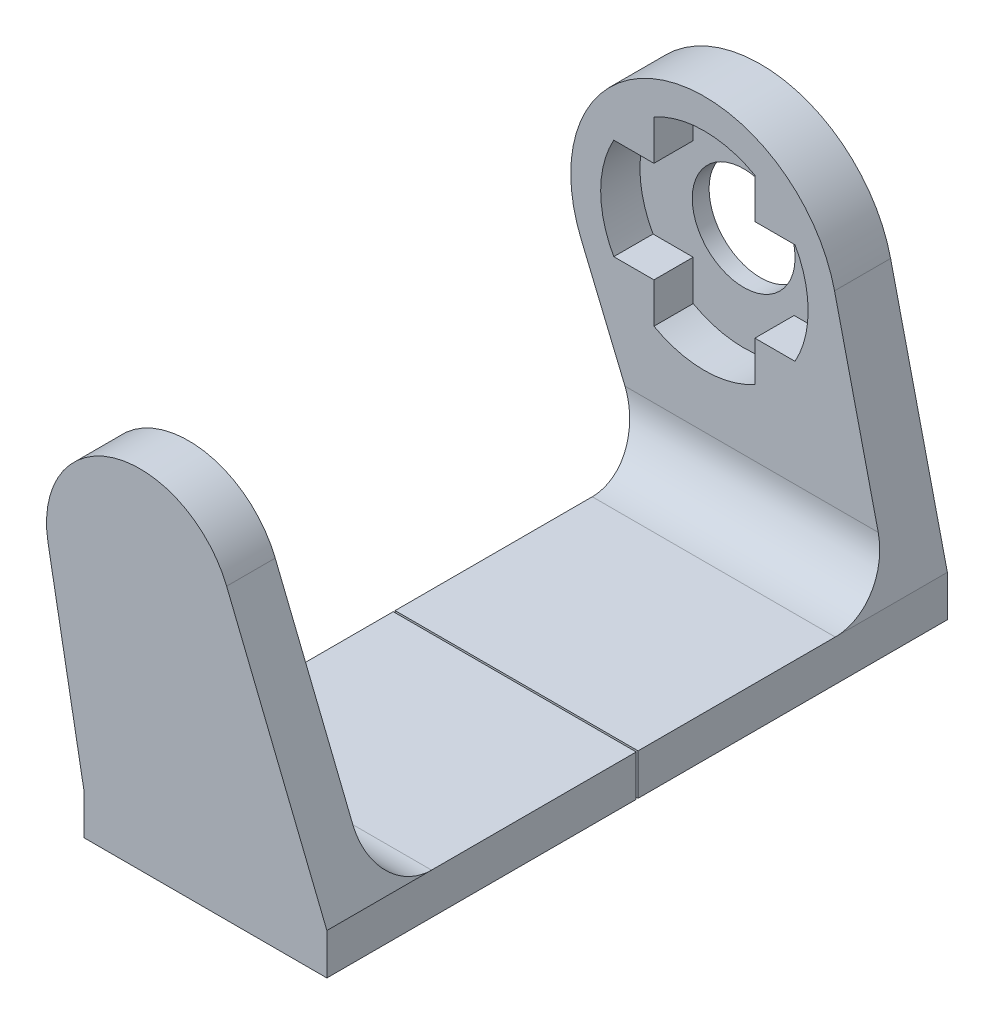
ISO-10303-21;
HEADER;
FILE_DESCRIPTION(('STEP AP214'),'2;1');
FILE_NAME('part.step','',(''),(''),'','','');
FILE_SCHEMA(('AUTOMOTIVE_DESIGN { 1 0 10303 214 1 1 1 1 }'));
ENDSEC;
DATA;
#1=APPLICATION_CONTEXT('core data for automotive mechanical design processes');
#2=APPLICATION_PROTOCOL_DEFINITION('international standard','automotive_design',2000,#1);
#3=PRODUCT_CONTEXT('',#1,'mechanical');
#4=PRODUCT('Part','Part','',(#3));
#5=PRODUCT_RELATED_PRODUCT_CATEGORY('part','',(#4));
#6=PRODUCT_DEFINITION_FORMATION('','',#4);
#7=PRODUCT_DEFINITION_CONTEXT('part definition',#1,'design');
#8=PRODUCT_DEFINITION('design','',#6,#7);
#9=PRODUCT_DEFINITION_SHAPE('','',#8);
#10=(LENGTH_UNIT() NAMED_UNIT(*) SI_UNIT(.MILLI.,.METRE.));
#11=(NAMED_UNIT(*) PLANE_ANGLE_UNIT() SI_UNIT($,.RADIAN.));
#12=(NAMED_UNIT(*) SI_UNIT($,.STERADIAN.) SOLID_ANGLE_UNIT());
#13=UNCERTAINTY_MEASURE_WITH_UNIT(LENGTH_MEASURE(1.E-05),#10,'distance_accuracy_value','');
#14=(GEOMETRIC_REPRESENTATION_CONTEXT(3) GLOBAL_UNCERTAINTY_ASSIGNED_CONTEXT((#13)) GLOBAL_UNIT_ASSIGNED_CONTEXT((#10,
#11,#12)) REPRESENTATION_CONTEXT('',''));
#15=CARTESIAN_POINT('',(0.,0.,0.));
#16=DIRECTION('',(0.,0.,1.));
#17=DIRECTION('',(1.,0.,0.));
#18=AXIS2_PLACEMENT_3D('',#15,#16,#17);
#19=CARTESIAN_POINT('',(12.9998092376302,-81.8996521323785,-19.85));
#20=DIRECTION('',(0.,0.,1.));
#21=DIRECTION('',(-1.,0.,0.));
#22=AXIS2_PLACEMENT_3D('',#19,#20,#21);
#23=PLANE('',#22);
#24=CARTESIAN_POINT('',(12.9999812376302,-81.8993076323785,-19.85));
#25=DIRECTION('',(0.,0.,-1.));
#26=DIRECTION('',(-1.,0.,0.));
#27=AXIS2_PLACEMENT_3D('',#24,#25,#26);
#28=CIRCLE('',#27,2.75);
#29=CARTESIAN_POINT('',(10.2499812376302,-81.8993076323785,-19.85));
#30=VERTEX_POINT('',#29);
#31=EDGE_CURVE('E375',#30,#30,#28,.T.);
#32=ORIENTED_EDGE('',*,*,#31,.T.);
#33=EDGE_LOOP('',(#32));
#34=FACE_BOUND('',#33,.T.);
#35=DIRECTION('',(0.,-1.,0.));
#36=VECTOR('',#35,1.);
#37=CARTESIAN_POINT('',(15.6998092376302,-77.1372997724622,-19.85));
#38=LINE('',#37,#36);
#39=CARTESIAN_POINT('',(15.6998092376302,-77.0506831698051,-19.85));
#40=VERTEX_POINT('',#39);
#41=CARTESIAN_POINT('',(15.6998092376302,-79.1996521323784,-19.85));
#42=VERTEX_POINT('',#41);
#43=EDGE_CURVE('E306',#40,#42,#38,.T.);
#44=ORIENTED_EDGE('',*,*,#43,.F.);
#45=CARTESIAN_POINT('',(12.9998092376302,-81.8996521323785,-19.85));
#46=DIRECTION('',(0.,0.,-1.));
#47=DIRECTION('',(-1.,0.,0.));
#48=AXIS2_PLACEMENT_3D('',#45,#46,#47);
#49=CIRCLE('',#48,5.55000000000001);
#50=CARTESIAN_POINT('',(10.2998092376302,-77.0506831698051,-19.85));
#51=VERTEX_POINT('',#50);
#52=EDGE_CURVE('E272',#51,#40,#49,.T.);
#53=ORIENTED_EDGE('',*,*,#52,.F.);
#54=DIRECTION('',(0.,1.,0.));
#55=VECTOR('',#54,1.);
#56=CARTESIAN_POINT('',(10.2998092376302,-77.1372997724622,-19.85));
#57=LINE('',#56,#55);
#58=CARTESIAN_POINT('',(10.2998092376302,-79.1996521323784,-19.85));
#59=VERTEX_POINT('',#58);
#60=EDGE_CURVE('E343',#59,#51,#57,.T.);
#61=ORIENTED_EDGE('',*,*,#60,.F.);
#62=DIRECTION('',(1.,0.,0.));
#63=VECTOR('',#62,1.);
#64=CARTESIAN_POINT('',(8.23745687771393,-79.1996521323784,-19.85));
#65=LINE('',#64,#63);
#66=CARTESIAN_POINT('',(8.15084027505681,-79.1996521323784,-19.85));
#67=VERTEX_POINT('',#66);
#68=EDGE_CURVE('E346',#67,#59,#65,.T.);
#69=ORIENTED_EDGE('',*,*,#68,.F.);
#70=CARTESIAN_POINT('',(12.9998092376302,-81.8996521323785,-19.85));
#71=DIRECTION('',(0.,0.,-1.));
#72=DIRECTION('',(-1.,0.,0.));
#73=AXIS2_PLACEMENT_3D('',#70,#71,#72);
#74=CIRCLE('',#73,5.55);
#75=CARTESIAN_POINT('',(8.15084027505681,-84.5996521323785,-19.85));
#76=VERTEX_POINT('',#75);
#77=EDGE_CURVE('E349',#76,#67,#74,.T.);
#78=ORIENTED_EDGE('',*,*,#77,.F.);
#79=DIRECTION('',(-1.,0.,0.));
#80=VECTOR('',#79,1.);
#81=CARTESIAN_POINT('',(8.23745687771393,-84.5996521323785,-19.85));
#82=LINE('',#81,#80);
#83=CARTESIAN_POINT('',(10.2998092376302,-84.5996521323785,-19.85));
#84=VERTEX_POINT('',#83);
#85=EDGE_CURVE('E352',#84,#76,#82,.T.);
#86=ORIENTED_EDGE('',*,*,#85,.F.);
#87=DIRECTION('',(0.,1.,0.));
#88=VECTOR('',#87,1.);
#89=CARTESIAN_POINT('',(10.2998092376302,-86.6620044922947,-19.85));
#90=LINE('',#89,#88);
#91=CARTESIAN_POINT('',(10.2998092376302,-86.7486210949518,-19.85));
#92=VERTEX_POINT('',#91);
#93=EDGE_CURVE('E355',#92,#84,#90,.T.);
#94=ORIENTED_EDGE('',*,*,#93,.F.);
#95=CARTESIAN_POINT('',(12.9998092376302,-81.8996521323785,-19.85));
#96=DIRECTION('',(0.,0.,-1.));
#97=DIRECTION('',(-1.,0.,0.));
#98=AXIS2_PLACEMENT_3D('',#95,#96,#97);
#99=CIRCLE('',#98,5.55000000000001);
#100=CARTESIAN_POINT('',(15.6998092376302,-86.7486210949518,-19.85));
#101=VERTEX_POINT('',#100);
#102=EDGE_CURVE('E358',#101,#92,#99,.T.);
#103=ORIENTED_EDGE('',*,*,#102,.F.);
#104=DIRECTION('',(0.,-1.,0.));
#105=VECTOR('',#104,1.);
#106=CARTESIAN_POINT('',(15.6998092376302,-86.6620044922947,-19.85));
#107=LINE('',#106,#105);
#108=CARTESIAN_POINT('',(15.6998092376302,-84.5996521323785,-19.85));
#109=VERTEX_POINT('',#108);
#110=EDGE_CURVE('E361',#109,#101,#107,.T.);
#111=ORIENTED_EDGE('',*,*,#110,.F.);
#112=DIRECTION('',(-1.,0.,0.));
#113=VECTOR('',#112,1.);
#114=CARTESIAN_POINT('',(17.7621615975465,-84.5996521323785,-19.85));
#115=LINE('',#114,#113);
#116=CARTESIAN_POINT('',(17.8487782002036,-84.5996521323785,-19.85));
#117=VERTEX_POINT('',#116);
#118=EDGE_CURVE('E364',#117,#109,#115,.T.);
#119=ORIENTED_EDGE('',*,*,#118,.F.);
#120=CARTESIAN_POINT('',(12.9998092376302,-81.8996521323785,-19.85));
#121=DIRECTION('',(0.,0.,-1.));
#122=DIRECTION('',(-1.,0.,0.));
#123=AXIS2_PLACEMENT_3D('',#120,#121,#122);
#124=CIRCLE('',#123,5.55000000000001);
#125=CARTESIAN_POINT('',(17.8487782002036,-79.1996521323784,-19.85));
#126=VERTEX_POINT('',#125);
#127=EDGE_CURVE('E367',#126,#117,#124,.T.);
#128=ORIENTED_EDGE('',*,*,#127,.F.);
#129=DIRECTION('',(1.,0.,0.));
#130=VECTOR('',#129,1.);
#131=CARTESIAN_POINT('',(17.7621615975465,-79.1996521323784,-19.85));
#132=LINE('',#131,#130);
#133=EDGE_CURVE('E370',#42,#126,#132,.T.);
#134=ORIENTED_EDGE('',*,*,#133,.F.);
#135=EDGE_LOOP('',(#44,#53,#61,#69,#78,#86,#94,#103,#111,#119,#128,#134));
#136=FACE_BOUND('',#135,.T.);
#137=ADVANCED_FACE('F42',(#34,#136),#23,.T.);
#138=CARTESIAN_POINT('',(17.7621615975465,-79.1996521323784,-19.85));
#139=DIRECTION('',(0.,1.,0.));
#140=DIRECTION('',(0.,0.,1.));
#141=AXIS2_PLACEMENT_3D('',#138,#139,#140);
#142=PLANE('',#141);
#143=DIRECTION('',(1.,0.,0.));
#144=VECTOR('',#143,1.);
#145=CARTESIAN_POINT('',(17.7621615975465,-79.1996521323784,-17.75));
#146=LINE('',#145,#144);
#147=CARTESIAN_POINT('',(15.6998092376302,-79.1996521323784,-17.75));
#148=VERTEX_POINT('',#147);
#149=CARTESIAN_POINT('',(17.8487782002036,-79.1996521323784,-17.75));
#150=VERTEX_POINT('',#149);
#151=EDGE_CURVE('E337',#148,#150,#146,.T.);
#152=ORIENTED_EDGE('',*,*,#151,.F.);
#153=DIRECTION('',(0.,0.,1.));
#154=VECTOR('',#153,1.);
#155=CARTESIAN_POINT('',(15.6998092376302,-79.1996521323784,-19.85));
#156=LINE('',#155,#154);
#157=EDGE_CURVE('E268',#42,#148,#156,.T.);
#158=ORIENTED_EDGE('',*,*,#157,.F.);
#159=ORIENTED_EDGE('',*,*,#133,.T.);
#160=DIRECTION('',(0.,0.,1.));
#161=VECTOR('',#160,1.);
#162=CARTESIAN_POINT('',(17.8487782002036,-79.1996521323784,-19.85));
#163=LINE('',#162,#161);
#164=EDGE_CURVE('E271',#126,#150,#163,.T.);
#165=ORIENTED_EDGE('',*,*,#164,.T.);
#166=EDGE_LOOP('',(#152,#158,#159,#165));
#167=FACE_BOUND('',#166,.T.);
#168=ADVANCED_FACE('F405',(#167),#142,.F.);
#169=CARTESIAN_POINT('',(12.9998092376302,-81.8996521323785,-19.85));
#170=DIRECTION('',(0.,0.,1.));
#171=DIRECTION('',(-1.,0.,0.));
#172=AXIS2_PLACEMENT_3D('',#169,#170,#171);
#173=CYLINDRICAL_SURFACE('',#172,5.55000000000001);
#174=CARTESIAN_POINT('',(12.9998092376302,-81.8996521323785,-17.75));
#175=DIRECTION('',(0.,0.,-1.));
#176=DIRECTION('',(-1.,0.,0.));
#177=AXIS2_PLACEMENT_3D('',#174,#175,#176);
#178=CIRCLE('',#177,5.55000000000001);
#179=CARTESIAN_POINT('',(17.8487782002036,-84.5996521323785,-17.75));
#180=VERTEX_POINT('',#179);
#181=EDGE_CURVE('E334',#150,#180,#178,.T.);
#182=ORIENTED_EDGE('',*,*,#181,.F.);
#183=ORIENTED_EDGE('',*,*,#164,.F.);
#184=ORIENTED_EDGE('',*,*,#127,.T.);
#185=DIRECTION('',(0.,0.,1.));
#186=VECTOR('',#185,1.);
#187=CARTESIAN_POINT('',(17.8487782002036,-84.5996521323785,-19.85));
#188=LINE('',#187,#186);
#189=EDGE_CURVE('E275',#117,#180,#188,.T.);
#190=ORIENTED_EDGE('',*,*,#189,.T.);
#191=EDGE_LOOP('',(#182,#183,#184,#190));
#192=FACE_BOUND('',#191,.T.);
#193=ADVANCED_FACE('F411',(#192),#173,.F.);
#194=CARTESIAN_POINT('',(17.7621615975465,-84.5996521323785,-19.85));
#195=DIRECTION('',(0.,-1.,0.));
#196=DIRECTION('',(0.,0.,-1.));
#197=AXIS2_PLACEMENT_3D('',#194,#195,#196);
#198=PLANE('',#197);
#199=DIRECTION('',(-1.,0.,0.));
#200=VECTOR('',#199,1.);
#201=CARTESIAN_POINT('',(17.7621615975465,-84.5996521323785,-17.75));
#202=LINE('',#201,#200);
#203=CARTESIAN_POINT('',(15.6998092376302,-84.5996521323785,-17.75));
#204=VERTEX_POINT('',#203);
#205=EDGE_CURVE('E331',#180,#204,#202,.T.);
#206=ORIENTED_EDGE('',*,*,#205,.F.);
#207=ORIENTED_EDGE('',*,*,#189,.F.);
#208=ORIENTED_EDGE('',*,*,#118,.T.);
#209=DIRECTION('',(0.,0.,1.));
#210=VECTOR('',#209,1.);
#211=CARTESIAN_POINT('',(15.6998092376302,-84.5996521323785,-19.85));
#212=LINE('',#211,#210);
#213=EDGE_CURVE('E278',#109,#204,#212,.T.);
#214=ORIENTED_EDGE('',*,*,#213,.T.);
#215=EDGE_LOOP('',(#206,#207,#208,#214));
#216=FACE_BOUND('',#215,.T.);
#217=ADVANCED_FACE('F452',(#216),#198,.F.);
#218=CARTESIAN_POINT('',(15.6998092376302,-86.6620044922947,-19.85));
#219=DIRECTION('',(1.,0.,0.));
#220=DIRECTION('',(0.,0.,1.));
#221=AXIS2_PLACEMENT_3D('',#218,#219,#220);
#222=PLANE('',#221);
#223=DIRECTION('',(0.,-1.,0.));
#224=VECTOR('',#223,1.);
#225=CARTESIAN_POINT('',(15.6998092376302,-86.6620044922947,-17.75));
#226=LINE('',#225,#224);
#227=CARTESIAN_POINT('',(15.6998092376302,-86.7486210949518,-17.75));
#228=VERTEX_POINT('',#227);
#229=EDGE_CURVE('E328',#204,#228,#226,.T.);
#230=ORIENTED_EDGE('',*,*,#229,.F.);
#231=ORIENTED_EDGE('',*,*,#213,.F.);
#232=ORIENTED_EDGE('',*,*,#110,.T.);
#233=DIRECTION('',(0.,0.,1.));
#234=VECTOR('',#233,1.);
#235=CARTESIAN_POINT('',(15.6998092376302,-86.7486210949518,-19.85));
#236=LINE('',#235,#234);
#237=EDGE_CURVE('E281',#101,#228,#236,.T.);
#238=ORIENTED_EDGE('',*,*,#237,.T.);
#239=EDGE_LOOP('',(#230,#231,#232,#238));
#240=FACE_BOUND('',#239,.T.);
#241=ADVANCED_FACE('F448',(#240),#222,.F.);
#242=CARTESIAN_POINT('',(12.9998092376302,-81.8996521323785,-19.85));
#243=DIRECTION('',(0.,0.,1.));
#244=DIRECTION('',(-1.,0.,0.));
#245=AXIS2_PLACEMENT_3D('',#242,#243,#244);
#246=CYLINDRICAL_SURFACE('',#245,5.55000000000001);
#247=CARTESIAN_POINT('',(12.9998092376302,-81.8996521323785,-17.75));
#248=DIRECTION('',(0.,0.,-1.));
#249=DIRECTION('',(-1.,0.,0.));
#250=AXIS2_PLACEMENT_3D('',#247,#248,#249);
#251=CIRCLE('',#250,5.55000000000001);
#252=CARTESIAN_POINT('',(10.2998092376302,-86.7486210949518,-17.75));
#253=VERTEX_POINT('',#252);
#254=EDGE_CURVE('E325',#228,#253,#251,.T.);
#255=ORIENTED_EDGE('',*,*,#254,.F.);
#256=ORIENTED_EDGE('',*,*,#237,.F.);
#257=ORIENTED_EDGE('',*,*,#102,.T.);
#258=DIRECTION('',(0.,0.,1.));
#259=VECTOR('',#258,1.);
#260=CARTESIAN_POINT('',(10.2998092376302,-86.7486210949518,-19.85));
#261=LINE('',#260,#259);
#262=EDGE_CURVE('E284',#92,#253,#261,.T.);
#263=ORIENTED_EDGE('',*,*,#262,.T.);
#264=EDGE_LOOP('',(#255,#256,#257,#263));
#265=FACE_BOUND('',#264,.T.);
#266=ADVANCED_FACE('F444',(#265),#246,.F.);
#267=CARTESIAN_POINT('',(10.2998092376302,-86.6620044922947,-19.85));
#268=DIRECTION('',(-1.,0.,0.));
#269=DIRECTION('',(0.,0.,-1.));
#270=AXIS2_PLACEMENT_3D('',#267,#268,#269);
#271=PLANE('',#270);
#272=DIRECTION('',(0.,1.,0.));
#273=VECTOR('',#272,1.);
#274=CARTESIAN_POINT('',(10.2998092376302,-86.6620044922947,-17.75));
#275=LINE('',#274,#273);
#276=CARTESIAN_POINT('',(10.2998092376302,-84.5996521323785,-17.75));
#277=VERTEX_POINT('',#276);
#278=EDGE_CURVE('E322',#253,#277,#275,.T.);
#279=ORIENTED_EDGE('',*,*,#278,.F.);
#280=ORIENTED_EDGE('',*,*,#262,.F.);
#281=ORIENTED_EDGE('',*,*,#93,.T.);
#282=DIRECTION('',(0.,0.,1.));
#283=VECTOR('',#282,1.);
#284=CARTESIAN_POINT('',(10.2998092376302,-84.5996521323785,-19.85));
#285=LINE('',#284,#283);
#286=EDGE_CURVE('E287',#84,#277,#285,.T.);
#287=ORIENTED_EDGE('',*,*,#286,.T.);
#288=EDGE_LOOP('',(#279,#280,#281,#287));
#289=FACE_BOUND('',#288,.T.);
#290=ADVANCED_FACE('F440',(#289),#271,.F.);
#291=CARTESIAN_POINT('',(8.23745687771393,-84.5996521323785,-19.85));
#292=DIRECTION('',(0.,-1.,0.));
#293=DIRECTION('',(0.,0.,-1.));
#294=AXIS2_PLACEMENT_3D('',#291,#292,#293);
#295=PLANE('',#294);
#296=DIRECTION('',(-1.,0.,0.));
#297=VECTOR('',#296,1.);
#298=CARTESIAN_POINT('',(8.23745687771393,-84.5996521323785,-17.75));
#299=LINE('',#298,#297);
#300=CARTESIAN_POINT('',(8.15084027505681,-84.5996521323785,-17.75));
#301=VERTEX_POINT('',#300);
#302=EDGE_CURVE('E319',#277,#301,#299,.T.);
#303=ORIENTED_EDGE('',*,*,#302,.F.);
#304=ORIENTED_EDGE('',*,*,#286,.F.);
#305=ORIENTED_EDGE('',*,*,#85,.T.);
#306=DIRECTION('',(0.,0.,1.));
#307=VECTOR('',#306,1.);
#308=CARTESIAN_POINT('',(8.15084027505681,-84.5996521323785,-19.85));
#309=LINE('',#308,#307);
#310=EDGE_CURVE('E290',#76,#301,#309,.T.);
#311=ORIENTED_EDGE('',*,*,#310,.T.);
#312=EDGE_LOOP('',(#303,#304,#305,#311));
#313=FACE_BOUND('',#312,.T.);
#314=ADVANCED_FACE('F436',(#313),#295,.F.);
#315=CARTESIAN_POINT('',(12.9998092376302,-81.8996521323785,-19.85));
#316=DIRECTION('',(0.,0.,1.));
#317=DIRECTION('',(-1.,0.,0.));
#318=AXIS2_PLACEMENT_3D('',#315,#316,#317);
#319=CYLINDRICAL_SURFACE('',#318,5.55);
#320=CARTESIAN_POINT('',(12.9998092376302,-81.8996521323785,-17.75));
#321=DIRECTION('',(0.,0.,-1.));
#322=DIRECTION('',(-1.,0.,0.));
#323=AXIS2_PLACEMENT_3D('',#320,#321,#322);
#324=CIRCLE('',#323,5.55);
#325=CARTESIAN_POINT('',(8.15084027505681,-79.1996521323784,-17.75));
#326=VERTEX_POINT('',#325);
#327=EDGE_CURVE('E316',#301,#326,#324,.T.);
#328=ORIENTED_EDGE('',*,*,#327,.F.);
#329=ORIENTED_EDGE('',*,*,#310,.F.);
#330=ORIENTED_EDGE('',*,*,#77,.T.);
#331=DIRECTION('',(0.,0.,1.));
#332=VECTOR('',#331,1.);
#333=CARTESIAN_POINT('',(8.15084027505681,-79.1996521323784,-19.85));
#334=LINE('',#333,#332);
#335=EDGE_CURVE('E293',#67,#326,#334,.T.);
#336=ORIENTED_EDGE('',*,*,#335,.T.);
#337=EDGE_LOOP('',(#328,#329,#330,#336));
#338=FACE_BOUND('',#337,.T.);
#339=ADVANCED_FACE('F432',(#338),#319,.F.);
#340=CARTESIAN_POINT('',(8.23745687771393,-79.1996521323784,-19.85));
#341=DIRECTION('',(0.,1.,0.));
#342=DIRECTION('',(0.,0.,1.));
#343=AXIS2_PLACEMENT_3D('',#340,#341,#342);
#344=PLANE('',#343);
#345=DIRECTION('',(1.,0.,0.));
#346=VECTOR('',#345,1.);
#347=CARTESIAN_POINT('',(8.23745687771393,-79.1996521323784,-17.75));
#348=LINE('',#347,#346);
#349=CARTESIAN_POINT('',(10.2998092376302,-79.1996521323784,-17.75));
#350=VERTEX_POINT('',#349);
#351=EDGE_CURVE('E313',#326,#350,#348,.T.);
#352=ORIENTED_EDGE('',*,*,#351,.F.);
#353=ORIENTED_EDGE('',*,*,#335,.F.);
#354=ORIENTED_EDGE('',*,*,#68,.T.);
#355=DIRECTION('',(0.,0.,1.));
#356=VECTOR('',#355,1.);
#357=CARTESIAN_POINT('',(10.2998092376302,-79.1996521323784,-19.85));
#358=LINE('',#357,#356);
#359=EDGE_CURVE('E296',#59,#350,#358,.T.);
#360=ORIENTED_EDGE('',*,*,#359,.T.);
#361=EDGE_LOOP('',(#352,#353,#354,#360));
#362=FACE_BOUND('',#361,.T.);
#363=ADVANCED_FACE('F428',(#362),#344,.F.);
#364=CARTESIAN_POINT('',(10.2998092376302,-77.1372997724622,-19.85));
#365=DIRECTION('',(-1.,0.,0.));
#366=DIRECTION('',(0.,0.,-1.));
#367=AXIS2_PLACEMENT_3D('',#364,#365,#366);
#368=PLANE('',#367);
#369=DIRECTION('',(0.,1.,0.));
#370=VECTOR('',#369,1.);
#371=CARTESIAN_POINT('',(10.2998092376302,-77.1372997724622,-17.75));
#372=LINE('',#371,#370);
#373=CARTESIAN_POINT('',(10.2998092376302,-77.0506831698051,-17.75));
#374=VERTEX_POINT('',#373);
#375=EDGE_CURVE('E310',#350,#374,#372,.T.);
#376=ORIENTED_EDGE('',*,*,#375,.F.);
#377=ORIENTED_EDGE('',*,*,#359,.F.);
#378=ORIENTED_EDGE('',*,*,#60,.T.);
#379=DIRECTION('',(0.,0.,1.));
#380=VECTOR('',#379,1.);
#381=CARTESIAN_POINT('',(10.2998092376302,-77.0506831698051,-19.85));
#382=LINE('',#381,#380);
#383=EDGE_CURVE('E299',#51,#374,#382,.T.);
#384=ORIENTED_EDGE('',*,*,#383,.T.);
#385=EDGE_LOOP('',(#376,#377,#378,#384));
#386=FACE_BOUND('',#385,.T.);
#387=ADVANCED_FACE('F424',(#386),#368,.F.);
#388=CARTESIAN_POINT('',(12.9998092376302,-81.8996521323785,-19.85));
#389=DIRECTION('',(0.,0.,1.));
#390=DIRECTION('',(-1.,0.,0.));
#391=AXIS2_PLACEMENT_3D('',#388,#389,#390);
#392=CYLINDRICAL_SURFACE('',#391,5.55000000000001);
#393=CARTESIAN_POINT('',(12.9998092376302,-81.8996521323785,-17.75));
#394=DIRECTION('',(0.,0.,-1.));
#395=DIRECTION('',(-1.,0.,0.));
#396=AXIS2_PLACEMENT_3D('',#393,#394,#395);
#397=CIRCLE('',#396,5.55000000000001);
#398=CARTESIAN_POINT('',(15.6998092376302,-77.0506831698051,-17.75));
#399=VERTEX_POINT('',#398);
#400=EDGE_CURVE('E307',#374,#399,#397,.T.);
#401=ORIENTED_EDGE('',*,*,#400,.F.);
#402=ORIENTED_EDGE('',*,*,#383,.F.);
#403=ORIENTED_EDGE('',*,*,#52,.T.);
#404=DIRECTION('',(0.,0.,1.));
#405=VECTOR('',#404,1.);
#406=CARTESIAN_POINT('',(15.6998092376302,-77.0506831698051,-19.85));
#407=LINE('',#406,#405);
#408=EDGE_CURVE('E260',#40,#399,#407,.T.);
#409=ORIENTED_EDGE('',*,*,#408,.T.);
#410=EDGE_LOOP('',(#401,#402,#403,#409));
#411=FACE_BOUND('',#410,.T.);
#412=ADVANCED_FACE('F420',(#411),#392,.F.);
#413=CARTESIAN_POINT('',(15.6998092376302,-77.1372997724622,-19.85));
#414=DIRECTION('',(1.,0.,0.));
#415=DIRECTION('',(0.,0.,1.));
#416=AXIS2_PLACEMENT_3D('',#413,#414,#415);
#417=PLANE('',#416);
#418=DIRECTION('',(0.,-1.,0.));
#419=VECTOR('',#418,1.);
#420=CARTESIAN_POINT('',(15.6998092376302,-77.1372997724622,-17.75));
#421=LINE('',#420,#419);
#422=EDGE_CURVE('E304',#399,#148,#421,.T.);
#423=ORIENTED_EDGE('',*,*,#422,.F.);
#424=ORIENTED_EDGE('',*,*,#408,.F.);
#425=ORIENTED_EDGE('',*,*,#43,.T.);
#426=ORIENTED_EDGE('',*,*,#157,.T.);
#427=EDGE_LOOP('',(#423,#424,#425,#426));
#428=FACE_BOUND('',#427,.T.);
#429=ADVANCED_FACE('F417',(#428),#417,.F.);
#430=CARTESIAN_POINT('',(12.9998092376302,-81.8996521323785,-20.75));
#431=DIRECTION('',(0.,0.,1.));
#432=DIRECTION('',(-1.,0.,0.));
#433=AXIS2_PLACEMENT_3D('',#430,#431,#432);
#434=CYLINDRICAL_SURFACE('',#433,7.15);
#435=CARTESIAN_POINT('',(12.9998092376302,-81.8996521323785,-17.75));
#436=DIRECTION('',(0.,0.,-1.));
#437=DIRECTION('',(-1.,0.,0.));
#438=AXIS2_PLACEMENT_3D('',#435,#436,#437);
#439=CIRCLE('',#438,7.15);
#440=CARTESIAN_POINT('',(6.39866542691876,-84.6469053770405,-17.75));
#441=VERTEX_POINT('',#440);
#442=CARTESIAN_POINT('',(19.9629923190944,-80.2758968016679,-17.75));
#443=VERTEX_POINT('',#442);
#444=EDGE_CURVE('E251',#441,#443,#439,.T.);
#445=ORIENTED_EDGE('',*,*,#444,.T.);
#446=DIRECTION('',(0.,0.,1.));
#447=VECTOR('',#446,1.);
#448=CARTESIAN_POINT('',(19.9629923190944,-80.2758968016679,-20.75));
#449=LINE('',#448,#447);
#450=CARTESIAN_POINT('',(19.9629923190944,-80.2758968016679,-20.75));
#451=VERTEX_POINT('',#450);
#452=EDGE_CURVE('E237',#451,#443,#449,.T.);
#453=ORIENTED_EDGE('',*,*,#452,.F.);
#454=CARTESIAN_POINT('',(12.9998092376302,-81.8996521323785,-20.75));
#455=DIRECTION('',(0.,0.,-1.));
#456=DIRECTION('',(-1.,0.,0.));
#457=AXIS2_PLACEMENT_3D('',#454,#455,#456);
#458=CIRCLE('',#457,7.15);
#459=CARTESIAN_POINT('',(6.39866542691876,-84.6469053770405,-20.75));
#460=VERTEX_POINT('',#459);
#461=EDGE_CURVE('E240',#460,#451,#458,.T.);
#462=ORIENTED_EDGE('',*,*,#461,.F.);
#463=DIRECTION('',(0.,0.,1.));
#464=VECTOR('',#463,1.);
#465=CARTESIAN_POINT('',(6.39866542691876,-84.6469053770405,-20.75));
#466=LINE('',#465,#464);
#467=EDGE_CURVE('E233',#460,#441,#466,.T.);
#468=ORIENTED_EDGE('',*,*,#467,.T.);
#469=EDGE_LOOP('',(#445,#453,#462,#468));
#470=FACE_BOUND('',#469,.T.);
#471=ADVANCED_FACE('F265',(#470),#434,.T.);
#472=CARTESIAN_POINT('',(12.9999812376302,-81.8993076323785,-20.75));
#473=DIRECTION('',(0.,0.,1.));
#474=DIRECTION('',(-1.,0.,0.));
#475=AXIS2_PLACEMENT_3D('',#472,#473,#474);
#476=CYLINDRICAL_SURFACE('',#475,2.75);
#477=CARTESIAN_POINT('',(12.9999812376302,-81.8993076323785,-20.75));
#478=DIRECTION('',(0.,0.,-1.));
#479=DIRECTION('',(-1.,0.,0.));
#480=AXIS2_PLACEMENT_3D('',#477,#478,#479);
#481=CIRCLE('',#480,2.75);
#482=CARTESIAN_POINT('',(10.2499812376302,-81.8993076323785,-20.75));
#483=VERTEX_POINT('',#482);
#484=EDGE_CURVE('E340',#483,#483,#481,.T.);
#485=ORIENTED_EDGE('',*,*,#484,.T.);
#486=EDGE_LOOP('',(#485));
#487=FACE_BOUND('',#486,.T.);
#488=ORIENTED_EDGE('',*,*,#31,.F.);
#489=EDGE_LOOP('',(#488));
#490=FACE_BOUND('',#489,.T.);
#491=ADVANCED_FACE('F393',(#487,#490),#476,.F.);
#492=CARTESIAN_POINT('',(12.9998092376302,-81.8996521323785,-17.75));
#493=DIRECTION('',(0.,0.,1.));
#494=DIRECTION('',(-1.,0.,0.));
#495=AXIS2_PLACEMENT_3D('',#492,#493,#494);
#496=PLANE('',#495);
#497=ORIENTED_EDGE('',*,*,#422,.T.);
#498=ORIENTED_EDGE('',*,*,#151,.T.);
#499=ORIENTED_EDGE('',*,*,#181,.T.);
#500=ORIENTED_EDGE('',*,*,#205,.T.);
#501=ORIENTED_EDGE('',*,*,#229,.T.);
#502=ORIENTED_EDGE('',*,*,#254,.T.);
#503=ORIENTED_EDGE('',*,*,#278,.T.);
#504=ORIENTED_EDGE('',*,*,#302,.T.);
#505=ORIENTED_EDGE('',*,*,#327,.T.);
#506=ORIENTED_EDGE('',*,*,#351,.T.);
#507=ORIENTED_EDGE('',*,*,#375,.T.);
#508=ORIENTED_EDGE('',*,*,#400,.T.);
#509=EDGE_LOOP('',(#497,#498,#499,#500,#501,#502,#503,#504,#505,#506,#507,#508));
#510=FACE_BOUND('',#509,.T.);
#511=DIRECTION('',(0.227098647651831,-0.973871759645339,0.));
#512=VECTOR('',#511,1.);
#513=CARTESIAN_POINT('',(23.0000603569878,-93.2998175726996,-17.75));
#514=LINE('',#513,#512);
#515=CARTESIAN_POINT('',(22.3004857608381,-90.2998175726996,-17.75));
#516=VERTEX_POINT('',#515);
#517=EDGE_CURVE('E249',#443,#516,#514,.T.);
#518=ORIENTED_EDGE('',*,*,#517,.F.);
#519=ORIENTED_EDGE('',*,*,#444,.F.);
#520=DIRECTION('',(-0.384231223029655,0.923236896602998,0.));
#521=VECTOR('',#520,1.);
#522=CARTESIAN_POINT('',(9.99982028537324,-93.2998175726996,-17.75));
#523=LINE('',#522,#521);
#524=CARTESIAN_POINT('',(8.75128518746907,-90.2998175726996,-17.75));
#525=VERTEX_POINT('',#524);
#526=EDGE_CURVE('E204',#525,#441,#523,.T.);
#527=ORIENTED_EDGE('',*,*,#526,.F.);
#528=DIRECTION('',(-1.,0.,0.));
#529=VECTOR('',#528,1.);
#530=CARTESIAN_POINT('',(12.9998092376302,-90.2998175726996,-17.75));
#531=LINE('',#530,#529);
#532=EDGE_CURVE('E217',#516,#525,#531,.T.);
#533=ORIENTED_EDGE('',*,*,#532,.F.);
#534=EDGE_LOOP('',(#518,#519,#527,#533));
#535=FACE_BOUND('',#534,.T.);
#536=ADVANCED_FACE('F391',(#510,#535),#496,.T.);
#537=CARTESIAN_POINT('',(23.0000603569878,-93.2998175726996,-20.75));
#538=DIRECTION('',(0.973871759645339,0.227098647651831,0.));
#539=DIRECTION('',(0.227098647651831,-0.973871759645339,0.));
#540=AXIS2_PLACEMENT_3D('',#537,#538,#539);
#541=PLANE('',#540);
#542=ORIENTED_EDGE('',*,*,#517,.T.);
#543=CARTESIAN_POINT('',(22.3004857608381,-90.2998175726996,-14.75));
#544=DIRECTION('',(-0.973871759645339,-0.227098647651831,0.));
#545=DIRECTION('',(-0.227098647651831,0.973871759645339,0.));
#546=AXIS2_PLACEMENT_3D('',#543,#544,#545);
#547=ELLIPSE('',#546,3.08048772365319,3.);
#548=CARTESIAN_POINT('',(23.0000603569878,-93.2998175726996,-14.75));
#549=VERTEX_POINT('',#548);
#550=EDGE_CURVE('E12',#549,#516,#547,.F.);
#551=ORIENTED_EDGE('',*,*,#550,.F.);
#552=DIRECTION('',(0.,0.,1.));
#553=VECTOR('',#552,1.);
#554=CARTESIAN_POINT('',(23.0000603569878,-93.2998175726996,-20.75));
#555=LINE('',#554,#553);
#556=CARTESIAN_POINT('',(23.0000603569878,-93.2998175726996,-20.75));
#557=VERTEX_POINT('',#556);
#558=EDGE_CURVE('E193',#557,#549,#555,.T.);
#559=ORIENTED_EDGE('',*,*,#558,.F.);
#560=DIRECTION('',(0.227098647651831,-0.973871759645339,0.));
#561=VECTOR('',#560,1.);
#562=CARTESIAN_POINT('',(23.0000603569878,-93.2998175726996,-20.75));
#563=LINE('',#562,#561);
#564=EDGE_CURVE('E234',#451,#557,#563,.T.);
#565=ORIENTED_EDGE('',*,*,#564,.F.);
#566=ORIENTED_EDGE('',*,*,#452,.T.);
#567=EDGE_LOOP('',(#542,#551,#559,#565,#566));
#568=FACE_BOUND('',#567,.T.);
#569=ADVANCED_FACE('F262',(#568),#541,.T.);
#570=CARTESIAN_POINT('',(9.99982028537324,-93.2998175726996,-20.75));
#571=DIRECTION('',(-0.923236896602998,-0.384231223029655,0.));
#572=DIRECTION('',(-0.384231223029655,0.923236896602998,0.));
#573=AXIS2_PLACEMENT_3D('',#570,#571,#572);
#574=PLANE('',#573);
#575=ORIENTED_EDGE('',*,*,#526,.T.);
#576=ORIENTED_EDGE('',*,*,#467,.F.);
#577=DIRECTION('',(-0.384231223029655,0.923236896602998,0.));
#578=VECTOR('',#577,1.);
#579=CARTESIAN_POINT('',(9.99982028537324,-93.2998175726996,-20.75));
#580=LINE('',#579,#578);
#581=CARTESIAN_POINT('',(9.99982028537324,-93.2998175726996,-20.75));
#582=VERTEX_POINT('',#581);
#583=EDGE_CURVE('E230',#582,#460,#580,.T.);
#584=ORIENTED_EDGE('',*,*,#583,.F.);
#585=DIRECTION('',(0.,0.,1.));
#586=VECTOR('',#585,1.);
#587=CARTESIAN_POINT('',(9.99982028537324,-93.2998175726996,-20.75));
#588=LINE('',#587,#586);
#589=CARTESIAN_POINT('',(9.99982028537324,-93.2998175726996,-14.75));
#590=VERTEX_POINT('',#589);
#591=EDGE_CURVE('E227',#582,#590,#588,.T.);
#592=ORIENTED_EDGE('',*,*,#591,.T.);
#593=CARTESIAN_POINT('',(8.75128518746908,-90.2998175726996,-14.75));
#594=DIRECTION('',(0.923236896602998,0.384231223029655,0.));
#595=DIRECTION('',(-0.384231223029655,0.923236896602998,0.));
#596=AXIS2_PLACEMENT_3D('',#593,#594,#595);
#597=ELLIPSE('',#596,3.24943685747216,3.);
#598=EDGE_CURVE('E51',#525,#590,#597,.F.);
#599=ORIENTED_EDGE('',*,*,#598,.F.);
#600=EDGE_LOOP('',(#575,#576,#584,#592,#599));
#601=FACE_BOUND('',#600,.T.);
#602=ADVANCED_FACE('F228',(#601),#574,.T.);
#603=CARTESIAN_POINT('',(12.9998092376302,-81.8996521323785,-20.75));
#604=DIRECTION('',(0.,0.,1.));
#605=DIRECTION('',(-1.,0.,0.));
#606=AXIS2_PLACEMENT_3D('',#603,#604,#605);
#607=PLANE('',#606);
#608=ORIENTED_EDGE('',*,*,#484,.F.);
#609=EDGE_LOOP('',(#608));
#610=FACE_BOUND('',#609,.T.);
#611=ORIENTED_EDGE('',*,*,#583,.T.);
#612=ORIENTED_EDGE('',*,*,#461,.T.);
#613=ORIENTED_EDGE('',*,*,#564,.T.);
#614=DIRECTION('',(0.,1.,0.));
#615=VECTOR('',#614,1.);
#616=CARTESIAN_POINT('',(23.0000603569878,-95.4998175726996,-20.75));
#617=LINE('',#616,#615);
#618=CARTESIAN_POINT('',(23.0000603569878,-95.4998175726996,-20.75));
#619=VERTEX_POINT('',#618);
#620=EDGE_CURVE('E378',#619,#557,#617,.T.);
#621=ORIENTED_EDGE('',*,*,#620,.F.);
#622=DIRECTION('',(-1.,0.,0.));
#623=VECTOR('',#622,1.);
#624=CARTESIAN_POINT('',(23.0000603569878,-95.4998175726996,-20.75));
#625=LINE('',#624,#623);
#626=CARTESIAN_POINT('',(9.99982028537324,-95.4998175726996,-20.75));
#627=VERTEX_POINT('',#626);
#628=EDGE_CURVE('E383',#619,#627,#625,.T.);
#629=ORIENTED_EDGE('',*,*,#628,.T.);
#630=DIRECTION('',(0.,1.,0.));
#631=VECTOR('',#630,1.);
#632=CARTESIAN_POINT('',(9.99982028537324,-95.4998175726996,-20.75));
#633=LINE('',#632,#631);
#634=EDGE_CURVE('E214',#627,#582,#633,.T.);
#635=ORIENTED_EDGE('',*,*,#634,.T.);
#636=EDGE_LOOP('',(#611,#612,#613,#621,#629,#635));
#637=FACE_BOUND('',#636,.T.);
#638=ADVANCED_FACE('F389',(#610,#637),#607,.F.);
#639=CARTESIAN_POINT('',(0.,-95.4998175726996,0.));
#640=DIRECTION('',(0.,-1.,0.));
#641=DIRECTION('',(0.,0.,-1.));
#642=AXIS2_PLACEMENT_3D('',#639,#640,#641);
#643=PLANE('',#642);
#644=DIRECTION('',(-1.,0.,0.));
#645=VECTOR('',#644,1.);
#646=CARTESIAN_POINT('',(9.99982028537324,-95.4998175726996,-4.2));
#647=LINE('',#646,#645);
#648=CARTESIAN_POINT('',(23.0000603569878,-95.4998175726996,-4.19999999999999));
#649=VERTEX_POINT('',#648);
#650=CARTESIAN_POINT('',(9.99982028537324,-95.4998175726996,-4.2));
#651=VERTEX_POINT('',#650);
#652=EDGE_CURVE('E182',#649,#651,#647,.T.);
#653=ORIENTED_EDGE('',*,*,#652,.T.);
#654=DIRECTION('',(0.,0.,1.));
#655=VECTOR('',#654,1.);
#656=CARTESIAN_POINT('',(9.99982028537324,-95.4998175726996,12.45));
#657=LINE('',#656,#655);
#658=EDGE_CURVE('E210',#627,#651,#657,.T.);
#659=ORIENTED_EDGE('',*,*,#658,.F.);
#660=ORIENTED_EDGE('',*,*,#628,.F.);
#661=DIRECTION('',(0.,0.,-1.));
#662=VECTOR('',#661,1.);
#663=CARTESIAN_POINT('',(23.0000603569878,-95.4998175726996,12.45));
#664=LINE('',#663,#662);
#665=EDGE_CURVE('E196',#649,#619,#664,.T.);
#666=ORIENTED_EDGE('',*,*,#665,.F.);
#667=EDGE_LOOP('',(#653,#659,#660,#666));
#668=FACE_BOUND('',#667,.T.);
#669=ADVANCED_FACE('F388',(#668),#643,.T.);
#670=CARTESIAN_POINT('',(9.99982028537324,-95.4998175726996,12.45));
#671=DIRECTION('',(1.,0.,0.));
#672=DIRECTION('',(0.,0.,1.));
#673=AXIS2_PLACEMENT_3D('',#670,#671,#672);
#674=PLANE('',#673);
#675=ORIENTED_EDGE('',*,*,#591,.F.);
#676=ORIENTED_EDGE('',*,*,#634,.F.);
#677=ORIENTED_EDGE('',*,*,#658,.T.);
#678=DIRECTION('',(0.,-1.,0.));
#679=VECTOR('',#678,1.);
#680=CARTESIAN_POINT('',(9.99982028537324,-93.2998175726996,-4.2));
#681=LINE('',#680,#679);
#682=CARTESIAN_POINT('',(9.99982028537324,-93.2998175726996,-4.2));
#683=VERTEX_POINT('',#682);
#684=EDGE_CURVE('E189',#683,#651,#681,.T.);
#685=ORIENTED_EDGE('',*,*,#684,.F.);
#686=DIRECTION('',(0.,0.,1.));
#687=VECTOR('',#686,1.);
#688=CARTESIAN_POINT('',(9.99982028537324,-93.2998175726996,12.45));
#689=LINE('',#688,#687);
#690=EDGE_CURVE('E178',#590,#683,#689,.T.);
#691=ORIENTED_EDGE('',*,*,#690,.F.);
#692=EDGE_LOOP('',(#675,#676,#677,#685,#691));
#693=FACE_BOUND('',#692,.T.);
#694=ADVANCED_FACE('F465',(#693),#674,.F.);
#695=CARTESIAN_POINT('',(23.0000603569878,-95.4998175726996,12.45));
#696=DIRECTION('',(-1.,0.,0.));
#697=DIRECTION('',(0.,0.,-1.));
#698=AXIS2_PLACEMENT_3D('',#695,#696,#697);
#699=PLANE('',#698);
#700=ORIENTED_EDGE('',*,*,#665,.T.);
#701=ORIENTED_EDGE('',*,*,#620,.T.);
#702=ORIENTED_EDGE('',*,*,#558,.T.);
#703=DIRECTION('',(0.,0.,-1.));
#704=VECTOR('',#703,1.);
#705=CARTESIAN_POINT('',(23.0000603569878,-93.2998175726996,12.45));
#706=LINE('',#705,#704);
#707=CARTESIAN_POINT('',(23.0000603569878,-93.2998175726996,-4.19999999999999));
#708=VERTEX_POINT('',#707);
#709=EDGE_CURVE('E176',#708,#549,#706,.T.);
#710=ORIENTED_EDGE('',*,*,#709,.F.);
#711=DIRECTION('',(0.,-1.,0.));
#712=VECTOR('',#711,1.);
#713=CARTESIAN_POINT('',(23.0000603569878,-93.2998175726996,-4.19999999999999));
#714=LINE('',#713,#712);
#715=EDGE_CURVE('E181',#708,#649,#714,.T.);
#716=ORIENTED_EDGE('',*,*,#715,.T.);
#717=EDGE_LOOP('',(#700,#701,#702,#710,#716));
#718=FACE_BOUND('',#717,.T.);
#719=ADVANCED_FACE('F191',(#718),#699,.F.);
#720=CARTESIAN_POINT('',(0.,-93.2998175726996,0.));
#721=DIRECTION('',(0.,-1.,0.));
#722=DIRECTION('',(0.,0.,-1.));
#723=AXIS2_PLACEMENT_3D('',#720,#721,#722);
#724=PLANE('',#723);
#725=ORIENTED_EDGE('',*,*,#690,.T.);
#726=DIRECTION('',(-1.,0.,0.));
#727=VECTOR('',#726,1.);
#728=CARTESIAN_POINT('',(9.99982028537324,-93.2998175726996,-4.2));
#729=LINE('',#728,#727);
#730=EDGE_CURVE('E172',#708,#683,#729,.T.);
#731=ORIENTED_EDGE('',*,*,#730,.F.);
#732=ORIENTED_EDGE('',*,*,#709,.T.);
#733=DIRECTION('',(-1.,0.,0.));
#734=VECTOR('',#733,1.);
#735=CARTESIAN_POINT('',(0.,-93.2998175726996,-14.75));
#736=LINE('',#735,#734);
#737=EDGE_CURVE('E57',#590,#549,#736,.F.);
#738=ORIENTED_EDGE('',*,*,#737,.F.);
#739=EDGE_LOOP('',(#725,#731,#732,#738));
#740=FACE_BOUND('',#739,.T.);
#741=ADVANCED_FACE('F174',(#740),#724,.F.);
#742=CARTESIAN_POINT('',(9.99982028537324,-93.2998175726996,-4.2));
#743=DIRECTION('',(0.,0.,-1.));
#744=DIRECTION('',(1.,0.,0.));
#745=AXIS2_PLACEMENT_3D('',#742,#743,#744);
#746=PLANE('',#745);
#747=ORIENTED_EDGE('',*,*,#652,.F.);
#748=ORIENTED_EDGE('',*,*,#715,.F.);
#749=ORIENTED_EDGE('',*,*,#730,.T.);
#750=ORIENTED_EDGE('',*,*,#684,.T.);
#751=EDGE_LOOP('',(#747,#748,#749,#750));
#752=FACE_BOUND('',#751,.T.);
#753=ADVANCED_FACE('F185',(#752),#746,.F.);
#754=CARTESIAN_POINT('',(12.9998092376302,-90.2998175726996,-14.75));
#755=DIRECTION('',(-1.,0.,0.));
#756=DIRECTION('',(0.,0.,-1.));
#757=AXIS2_PLACEMENT_3D('',#754,#755,#756);
#758=CYLINDRICAL_SURFACE('',#757,3.);
#759=ORIENTED_EDGE('',*,*,#550,.T.);
#760=ORIENTED_EDGE('',*,*,#532,.T.);
#761=ORIENTED_EDGE('',*,*,#598,.T.);
#762=ORIENTED_EDGE('',*,*,#737,.T.);
#763=EDGE_LOOP('',(#759,#760,#761,#762));
#764=FACE_BOUND('',#763,.T.);
#765=ADVANCED_FACE('F44',(#764),#758,.F.);
#766=CLOSED_SHELL('',(#137,#168,#193,#217,#241,#266,#290,#314,#339,#363,#387,#412,#429,#471,
#491,#536,#569,#602,#638,#669,#694,#719,#741,#753,#765));
#767=MANIFOLD_SOLID_BREP('B2',#766);
#768=CARTESIAN_POINT('',(0.,-93.2998175726996,0.));
#769=DIRECTION('',(0.,-1.,0.));
#770=DIRECTION('',(0.,0.,-1.));
#771=AXIS2_PLACEMENT_3D('',#768,#769,#770);
#772=PLANE('',#771);
#773=DIRECTION('',(0.,0.,-1.));
#774=VECTOR('',#773,1.);
#775=CARTESIAN_POINT('',(23.0000603569878,-93.2998175726996,12.45));
#776=LINE('',#775,#774);
#777=CARTESIAN_POINT('',(23.0000603569878,-93.2998175726996,6.85000000000001));
#778=VERTEX_POINT('',#777);
#779=CARTESIAN_POINT('',(23.0000603569878,-93.2998175726996,-4.09999999999999));
#780=VERTEX_POINT('',#779);
#781=EDGE_CURVE('E744',#778,#780,#776,.T.);
#782=ORIENTED_EDGE('',*,*,#781,.T.);
#783=DIRECTION('',(1.,0.,0.));
#784=VECTOR('',#783,1.);
#785=CARTESIAN_POINT('',(23.0000603569878,-93.2998175726996,-4.09999999999999));
#786=LINE('',#785,#784);
#787=CARTESIAN_POINT('',(9.99982028537324,-93.2998175726996,-4.1));
#788=VERTEX_POINT('',#787);
#789=EDGE_CURVE('E751',#788,#780,#786,.T.);
#790=ORIENTED_EDGE('',*,*,#789,.F.);
#791=DIRECTION('',(0.,0.,1.));
#792=VECTOR('',#791,1.);
#793=CARTESIAN_POINT('',(9.99982028537324,-93.2998175726996,12.45));
#794=LINE('',#793,#792);
#795=CARTESIAN_POINT('',(9.99982028537324,-93.2998175726996,6.85));
#796=VERTEX_POINT('',#795);
#797=EDGE_CURVE('E800',#788,#796,#794,.T.);
#798=ORIENTED_EDGE('',*,*,#797,.T.);
#799=DIRECTION('',(-1.,0.,0.));
#800=VECTOR('',#799,1.);
#801=CARTESIAN_POINT('',(9.99982028537324,-93.2998175726996,6.85));
#802=LINE('',#801,#800);
#803=EDGE_CURVE('E759',#778,#796,#802,.T.);
#804=ORIENTED_EDGE('',*,*,#803,.F.);
#805=EDGE_LOOP('',(#782,#790,#798,#804));
#806=FACE_BOUND('',#805,.T.);
#807=ADVANCED_FACE('F666',(#806),#772,.F.);
#808=CARTESIAN_POINT('',(23.0000603569878,-95.4998175726996,12.45));
#809=DIRECTION('',(-1.,0.,0.));
#810=DIRECTION('',(0.,0.,-1.));
#811=AXIS2_PLACEMENT_3D('',#808,#809,#810);
#812=PLANE('',#811);
#813=CARTESIAN_POINT('',(23.0000603569878,-93.2998175726996,12.45));
#814=VERTEX_POINT('',#813);
#815=EDGE_CURVE('E804',#814,#778,#776,.T.);
#816=ORIENTED_EDGE('',*,*,#815,.F.);
#817=DIRECTION('',(0.,1.,0.));
#818=VECTOR('',#817,1.);
#819=CARTESIAN_POINT('',(23.0000603569878,-95.4998175726996,12.45));
#820=LINE('',#819,#818);
#821=CARTESIAN_POINT('',(23.0000603569878,-95.4998175726996,12.45));
#822=VERTEX_POINT('',#821);
#823=EDGE_CURVE('E748',#822,#814,#820,.T.);
#824=ORIENTED_EDGE('',*,*,#823,.F.);
#825=DIRECTION('',(0.,0.,-1.));
#826=VECTOR('',#825,1.);
#827=CARTESIAN_POINT('',(23.0000603569878,-95.4998175726996,12.45));
#828=LINE('',#827,#826);
#829=CARTESIAN_POINT('',(23.0000603569878,-95.4998175726996,-4.09999999999999));
#830=VERTEX_POINT('',#829);
#831=EDGE_CURVE('E747',#822,#830,#828,.T.);
#832=ORIENTED_EDGE('',*,*,#831,.T.);
#833=DIRECTION('',(0.,-1.,0.));
#834=VECTOR('',#833,1.);
#835=CARTESIAN_POINT('',(23.0000603569878,-93.2998175726996,-4.09999999999999));
#836=LINE('',#835,#834);
#837=EDGE_CURVE('E739',#780,#830,#836,.T.);
#838=ORIENTED_EDGE('',*,*,#837,.F.);
#839=ORIENTED_EDGE('',*,*,#781,.F.);
#840=EDGE_LOOP('',(#816,#824,#832,#838,#839));
#841=FACE_BOUND('',#840,.T.);
#842=ADVANCED_FACE('F742',(#841),#812,.F.);
#843=CARTESIAN_POINT('',(9.99982028537324,-95.4998175726996,12.45));
#844=DIRECTION('',(1.,0.,0.));
#845=DIRECTION('',(0.,0.,1.));
#846=AXIS2_PLACEMENT_3D('',#843,#844,#845);
#847=PLANE('',#846);
#848=DIRECTION('',(0.,0.,1.));
#849=VECTOR('',#848,1.);
#850=CARTESIAN_POINT('',(9.99982028537324,-95.4998175726996,12.45));
#851=LINE('',#850,#849);
#852=CARTESIAN_POINT('',(9.99982028537324,-95.4998175726996,-4.1));
#853=VERTEX_POINT('',#852);
#854=CARTESIAN_POINT('',(9.99982028537324,-95.4998175726996,12.45));
#855=VERTEX_POINT('',#854);
#856=EDGE_CURVE('E796',#853,#855,#851,.T.);
#857=ORIENTED_EDGE('',*,*,#856,.T.);
#858=DIRECTION('',(0.,1.,0.));
#859=VECTOR('',#858,1.);
#860=CARTESIAN_POINT('',(9.99982028537324,-95.4998175726996,12.45));
#861=LINE('',#860,#859);
#862=CARTESIAN_POINT('',(9.99982028537324,-93.2998175726996,12.45));
#863=VERTEX_POINT('',#862);
#864=EDGE_CURVE('E786',#855,#863,#861,.T.);
#865=ORIENTED_EDGE('',*,*,#864,.T.);
#866=DIRECTION('',(0.,0.,-1.));
#867=VECTOR('',#866,1.);
#868=CARTESIAN_POINT('',(9.99982028537324,-93.2998175726996,12.45));
#869=LINE('',#868,#867);
#870=EDGE_CURVE('E772',#863,#796,#869,.T.);
#871=ORIENTED_EDGE('',*,*,#870,.T.);
#872=ORIENTED_EDGE('',*,*,#797,.F.);
#873=DIRECTION('',(0.,-1.,0.));
#874=VECTOR('',#873,1.);
#875=CARTESIAN_POINT('',(9.99982028537324,-93.2998175726996,-4.1));
#876=LINE('',#875,#874);
#877=EDGE_CURVE('E753',#788,#853,#876,.T.);
#878=ORIENTED_EDGE('',*,*,#877,.T.);
#879=EDGE_LOOP('',(#857,#865,#871,#872,#878));
#880=FACE_BOUND('',#879,.T.);
#881=ADVANCED_FACE('F828',(#880),#847,.F.);
#882=CARTESIAN_POINT('',(0.,-95.4998175726996,0.));
#883=DIRECTION('',(0.,-1.,0.));
#884=DIRECTION('',(0.,0.,-1.));
#885=AXIS2_PLACEMENT_3D('',#882,#883,#884);
#886=PLANE('',#885);
#887=DIRECTION('',(1.,0.,0.));
#888=VECTOR('',#887,1.);
#889=CARTESIAN_POINT('',(23.0000603569878,-95.4998175726996,-4.09999999999999));
#890=LINE('',#889,#888);
#891=EDGE_CURVE('E705',#853,#830,#890,.T.);
#892=ORIENTED_EDGE('',*,*,#891,.T.);
#893=ORIENTED_EDGE('',*,*,#831,.F.);
#894=DIRECTION('',(1.,0.,0.));
#895=VECTOR('',#894,1.);
#896=CARTESIAN_POINT('',(23.0000603569878,-95.4998175726996,12.45));
#897=LINE('',#896,#895);
#898=EDGE_CURVE('E799',#855,#822,#897,.T.);
#899=ORIENTED_EDGE('',*,*,#898,.F.);
#900=ORIENTED_EDGE('',*,*,#856,.F.);
#901=EDGE_LOOP('',(#892,#893,#899,#900));
#902=FACE_BOUND('',#901,.T.);
#903=ADVANCED_FACE('F826',(#902),#886,.T.);
#904=CARTESIAN_POINT('',(23.0000603569878,-95.4998175726996,12.45));
#905=DIRECTION('',(0.,0.,-1.));
#906=DIRECTION('',(1.,0.,0.));
#907=AXIS2_PLACEMENT_3D('',#904,#905,#906);
#908=PLANE('',#907);
#909=ORIENTED_EDGE('',*,*,#864,.F.);
#910=ORIENTED_EDGE('',*,*,#898,.T.);
#911=ORIENTED_EDGE('',*,*,#823,.T.);
#912=DIRECTION('',(0.374703363464617,-0.927144751054712,0.));
#913=VECTOR('',#912,1.);
#914=CARTESIAN_POINT('',(23.0000603569878,-93.2998175726996,12.45));
#915=LINE('',#914,#913);
#916=CARTESIAN_POINT('',(17.6355329929038,-80.0261353150554,12.45));
#917=VERTEX_POINT('',#916);
#918=EDGE_CURVE('E773',#917,#814,#915,.T.);
#919=ORIENTED_EDGE('',*,*,#918,.F.);
#920=CARTESIAN_POINT('',(12.9998092376302,-81.8996521323785,12.45));
#921=DIRECTION('',(0.,0.,-1.));
#922=DIRECTION('',(-1.,0.,0.));
#923=AXIS2_PLACEMENT_3D('',#920,#921,#922);
#924=CIRCLE('',#923,5.);
#925=CARTESIAN_POINT('',(8.08122186795485,-82.7982612169476,12.45));
#926=VERTEX_POINT('',#925);
#927=EDGE_CURVE('E777',#926,#917,#924,.T.);
#928=ORIENTED_EDGE('',*,*,#927,.F.);
#929=DIRECTION('',(-0.179721816913822,0.98371747393507,0.));
#930=VECTOR('',#929,1.);
#931=CARTESIAN_POINT('',(9.99982028537324,-93.2998175726996,12.45));
#932=LINE('',#931,#930);
#933=EDGE_CURVE('E784',#863,#926,#932,.T.);
#934=ORIENTED_EDGE('',*,*,#933,.F.);
#935=EDGE_LOOP('',(#909,#910,#911,#919,#928,#934));
#936=FACE_BOUND('',#935,.T.);
#937=ADVANCED_FACE('F823',(#936),#908,.F.);
#938=CARTESIAN_POINT('',(9.99982028537324,-93.2998175726996,12.45));
#939=DIRECTION('',(0.98371747393507,0.179721816913822,0.));
#940=DIRECTION('',(0.179721816913822,-0.98371747393507,0.));
#941=AXIS2_PLACEMENT_3D('',#938,#939,#940);
#942=PLANE('',#941);
#943=ORIENTED_EDGE('',*,*,#870,.F.);
#944=ORIENTED_EDGE('',*,*,#933,.T.);
#945=DIRECTION('',(0.,0.,-1.));
#946=VECTOR('',#945,1.);
#947=CARTESIAN_POINT('',(8.08122186795485,-82.7982612169476,12.45));
#948=LINE('',#947,#946);
#949=CARTESIAN_POINT('',(8.08122186795485,-82.7982612169476,9.85));
#950=VERTEX_POINT('',#949);
#951=EDGE_CURVE('E770',#926,#950,#948,.T.);
#952=ORIENTED_EDGE('',*,*,#951,.T.);
#953=DIRECTION('',(-0.179721816913822,0.98371747393507,0.));
#954=VECTOR('',#953,1.);
#955=CARTESIAN_POINT('',(9.99982028537324,-93.2998175726996,9.85));
#956=LINE('',#955,#954);
#957=CARTESIAN_POINT('',(9.45173054921689,-90.2998175726996,9.85));
#958=VERTEX_POINT('',#957);
#959=EDGE_CURVE('E767',#958,#950,#956,.T.);
#960=ORIENTED_EDGE('',*,*,#959,.F.);
#961=CARTESIAN_POINT('',(9.45173054921689,-90.2998175726996,6.85));
#962=DIRECTION('',(-0.98371747393507,-0.179721816913822,0.));
#963=DIRECTION('',(0.179721816913822,-0.98371747393507,0.));
#964=AXIS2_PLACEMENT_3D('',#961,#962,#963);
#965=ELLIPSE('',#964,3.04965610501905,3.);
#966=EDGE_CURVE('E674',#796,#958,#965,.T.);
#967=ORIENTED_EDGE('',*,*,#966,.F.);
#968=EDGE_LOOP('',(#943,#944,#952,#960,#967));
#969=FACE_BOUND('',#968,.T.);
#970=ADVANCED_FACE('F768',(#969),#942,.F.);
#971=CARTESIAN_POINT('',(12.9998092376302,-81.8996521323785,12.45));
#972=DIRECTION('',(0.,0.,-1.));
#973=DIRECTION('',(1.,0.,0.));
#974=AXIS2_PLACEMENT_3D('',#971,#972,#973);
#975=CYLINDRICAL_SURFACE('',#974,5.);
#976=CARTESIAN_POINT('',(12.9998092376302,-81.8996521323785,9.85));
#977=DIRECTION('',(0.,0.,-1.));
#978=DIRECTION('',(-1.,0.,0.));
#979=AXIS2_PLACEMENT_3D('',#976,#977,#978);
#980=CIRCLE('',#979,5.);
#981=CARTESIAN_POINT('',(17.6355329929038,-80.0261353150554,9.85));
#982=VERTEX_POINT('',#981);
#983=EDGE_CURVE('E775',#950,#982,#980,.T.);
#984=ORIENTED_EDGE('',*,*,#983,.F.);
#985=ORIENTED_EDGE('',*,*,#951,.F.);
#986=ORIENTED_EDGE('',*,*,#927,.T.);
#987=DIRECTION('',(0.,0.,-1.));
#988=VECTOR('',#987,1.);
#989=CARTESIAN_POINT('',(17.6355329929038,-80.0261353150554,12.45));
#990=LINE('',#989,#988);
#991=EDGE_CURVE('E791',#917,#982,#990,.T.);
#992=ORIENTED_EDGE('',*,*,#991,.T.);
#993=EDGE_LOOP('',(#984,#985,#986,#992));
#994=FACE_BOUND('',#993,.T.);
#995=ADVANCED_FACE('F818',(#994),#975,.T.);
#996=CARTESIAN_POINT('',(23.0000603569878,-93.2998175726996,12.45));
#997=DIRECTION('',(-0.927144751054712,-0.374703363464617,0.));
#998=DIRECTION('',(-0.374703363464617,0.927144751054712,0.));
#999=AXIS2_PLACEMENT_3D('',#996,#997,#998);
#1000=PLANE('',#999);
#1001=DIRECTION('',(0.374703363464617,-0.927144751054712,0.));
#1002=VECTOR('',#1001,1.);
#1003=CARTESIAN_POINT('',(23.0000603569878,-93.2998175726996,9.85));
#1004=LINE('',#1003,#1002);
#1005=CARTESIAN_POINT('',(21.7876174357341,-90.2998175726996,9.85));
#1006=VERTEX_POINT('',#1005);
#1007=EDGE_CURVE('E812',#982,#1006,#1004,.T.);
#1008=ORIENTED_EDGE('',*,*,#1007,.F.);
#1009=ORIENTED_EDGE('',*,*,#991,.F.);
#1010=ORIENTED_EDGE('',*,*,#918,.T.);
#1011=ORIENTED_EDGE('',*,*,#815,.T.);
#1012=CARTESIAN_POINT('',(21.7876174357341,-90.2998175726996,6.85));
#1013=DIRECTION('',(0.927144751054712,0.374703363464617,0.));
#1014=DIRECTION('',(0.374703363464617,-0.927144751054712,0.));
#1015=AXIS2_PLACEMENT_3D('',#1012,#1013,#1014);
#1016=ELLIPSE('',#1015,3.23574069376678,3.);
#1017=EDGE_CURVE('E40',#1006,#778,#1016,.T.);
#1018=ORIENTED_EDGE('',*,*,#1017,.F.);
#1019=EDGE_LOOP('',(#1008,#1009,#1010,#1011,#1018));
#1020=FACE_BOUND('',#1019,.T.);
#1021=ADVANCED_FACE('F816',(#1020),#1000,.F.);
#1022=CARTESIAN_POINT('',(12.9998092376302,-81.8996521323785,9.85));
#1023=DIRECTION('',(0.,0.,1.));
#1024=DIRECTION('',(-1.,0.,0.));
#1025=AXIS2_PLACEMENT_3D('',#1022,#1023,#1024);
#1026=PLANE('',#1025);
#1027=CARTESIAN_POINT('',(12.9998092376302,-81.8996521323785,9.85));
#1028=DIRECTION('',(0.,0.,1.));
#1029=DIRECTION('',(1.,0.,0.));
#1030=AXIS2_PLACEMENT_3D('',#1027,#1028,#1029);
#1031=CIRCLE('',#1030,2.);
#1032=CARTESIAN_POINT('',(14.9998092376302,-81.8996521323785,9.85));
#1033=VERTEX_POINT('',#1032);
#1034=EDGE_CURVE('E787',#1033,#1033,#1031,.T.);
#1035=ORIENTED_EDGE('',*,*,#1034,.T.);
#1036=EDGE_LOOP('',(#1035));
#1037=FACE_BOUND('',#1036,.T.);
#1038=ORIENTED_EDGE('',*,*,#959,.T.);
#1039=ORIENTED_EDGE('',*,*,#983,.T.);
#1040=ORIENTED_EDGE('',*,*,#1007,.T.);
#1041=DIRECTION('',(-1.,0.,0.));
#1042=VECTOR('',#1041,1.);
#1043=CARTESIAN_POINT('',(23.0000603569878,-90.2998175726996,9.85));
#1044=LINE('',#1043,#1042);
#1045=EDGE_CURVE('E687',#958,#1006,#1044,.F.);
#1046=ORIENTED_EDGE('',*,*,#1045,.F.);
#1047=EDGE_LOOP('',(#1038,#1039,#1040,#1046));
#1048=FACE_BOUND('',#1047,.T.);
#1049=ADVANCED_FACE('F814',(#1037,#1048),#1026,.F.);
#1050=CARTESIAN_POINT('',(12.9998092376302,-81.8996521323785,11.37));
#1051=DIRECTION('',(0.,0.,-1.));
#1052=DIRECTION('',(1.,0.,0.));
#1053=AXIS2_PLACEMENT_3D('',#1050,#1051,#1052);
#1054=CYLINDRICAL_SURFACE('',#1053,2.);
#1055=CARTESIAN_POINT('',(12.9998092376302,-81.8996521323785,11.37));
#1056=DIRECTION('',(0.,0.,1.));
#1057=DIRECTION('',(1.,0.,0.));
#1058=AXIS2_PLACEMENT_3D('',#1055,#1056,#1057);
#1059=CIRCLE('',#1058,2.);
#1060=CARTESIAN_POINT('',(14.9998092376302,-81.8996521323785,11.37));
#1061=VERTEX_POINT('',#1060);
#1062=EDGE_CURVE('E790',#1061,#1061,#1059,.T.);
#1063=ORIENTED_EDGE('',*,*,#1062,.T.);
#1064=EDGE_LOOP('',(#1063));
#1065=FACE_BOUND('',#1064,.T.);
#1066=ORIENTED_EDGE('',*,*,#1034,.F.);
#1067=EDGE_LOOP('',(#1066));
#1068=FACE_BOUND('',#1067,.T.);
#1069=ADVANCED_FACE('F900',(#1065,#1068),#1054,.F.);
#1070=CARTESIAN_POINT('',(12.9998092376302,-81.8996521323785,11.37));
#1071=DIRECTION('',(0.,0.,-1.));
#1072=DIRECTION('',(1.,0.,0.));
#1073=AXIS2_PLACEMENT_3D('',#1070,#1071,#1072);
#1074=PLANE('',#1073);
#1075=ORIENTED_EDGE('',*,*,#1062,.F.);
#1076=EDGE_LOOP('',(#1075));
#1077=FACE_BOUND('',#1076,.T.);
#1078=ADVANCED_FACE('F910',(#1077),#1074,.T.);
#1079=CARTESIAN_POINT('',(23.0000603569878,-93.2998175726996,-4.09999999999999));
#1080=DIRECTION('',(0.,0.,1.));
#1081=DIRECTION('',(-1.,0.,0.));
#1082=AXIS2_PLACEMENT_3D('',#1079,#1080,#1081);
#1083=PLANE('',#1082);
#1084=ORIENTED_EDGE('',*,*,#891,.F.);
#1085=ORIENTED_EDGE('',*,*,#877,.F.);
#1086=ORIENTED_EDGE('',*,*,#789,.T.);
#1087=ORIENTED_EDGE('',*,*,#837,.T.);
#1088=EDGE_LOOP('',(#1084,#1085,#1086,#1087));
#1089=FACE_BOUND('',#1088,.T.);
#1090=ADVANCED_FACE('F752',(#1089),#1083,.F.);
#1091=CARTESIAN_POINT('',(0.,-90.2998175726996,6.85));
#1092=DIRECTION('',(1.,0.,0.));
#1093=DIRECTION('',(0.,0.,1.));
#1094=AXIS2_PLACEMENT_3D('',#1091,#1092,#1093);
#1095=CYLINDRICAL_SURFACE('',#1094,3.);
#1096=ORIENTED_EDGE('',*,*,#1017,.T.);
#1097=ORIENTED_EDGE('',*,*,#803,.T.);
#1098=ORIENTED_EDGE('',*,*,#966,.T.);
#1099=ORIENTED_EDGE('',*,*,#1045,.T.);
#1100=EDGE_LOOP('',(#1096,#1097,#1098,#1099));
#1101=FACE_BOUND('',#1100,.T.);
#1102=ADVANCED_FACE('F668',(#1101),#1095,.F.);
#1103=CLOSED_SHELL('',(#807,#842,#881,#903,#937,#970,#995,#1021,#1049,#1069,#1078,#1090,#1102));
#1104=MANIFOLD_SOLID_BREP('B6',#1103);
#1105=ADVANCED_BREP_SHAPE_REPRESENTATION('',(#18,#767,#1104),#14);
#1106=SHAPE_DEFINITION_REPRESENTATION(#9,#1105);
ENDSEC;
END-ISO-10303-21;
